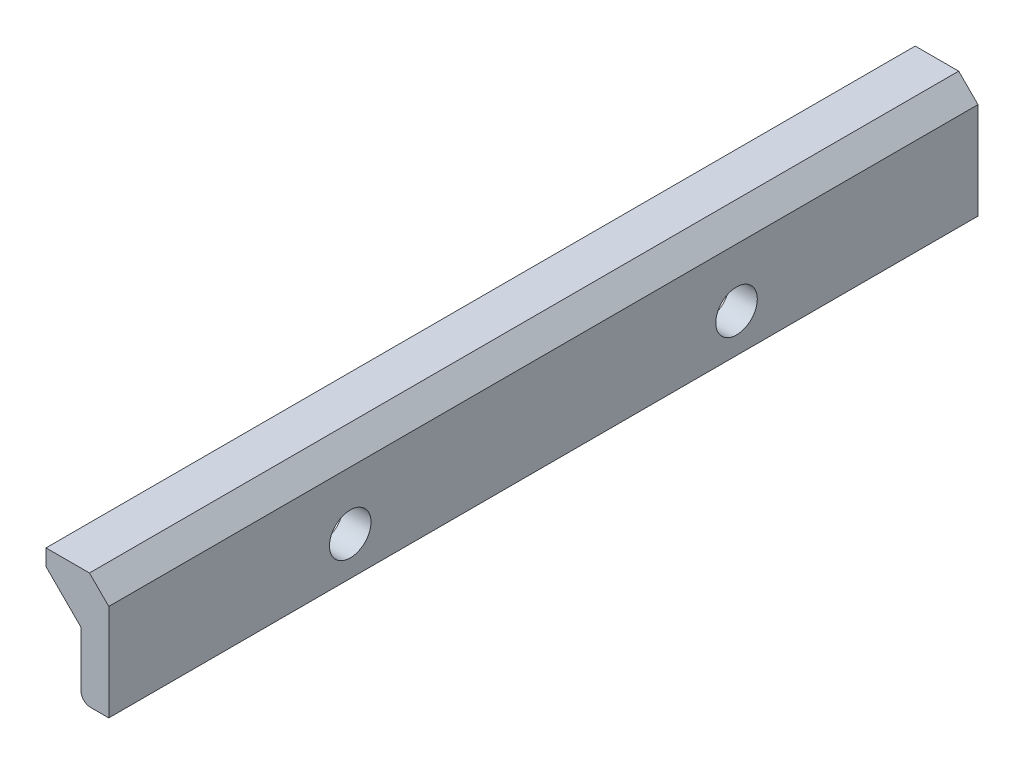
ISO-10303-21;
HEADER;
FILE_DESCRIPTION(('STEP AP214'),'2;1');
FILE_NAME('part.step','',(''),(''),'','','');
FILE_SCHEMA(('AUTOMOTIVE_DESIGN { 1 0 10303 214 1 1 1 1 }'));
ENDSEC;
DATA;
#1=APPLICATION_CONTEXT('core data for automotive mechanical design processes');
#2=APPLICATION_PROTOCOL_DEFINITION('international standard','automotive_design',2000,#1);
#3=PRODUCT_CONTEXT('',#1,'mechanical');
#4=PRODUCT('Part','Part','',(#3));
#5=PRODUCT_RELATED_PRODUCT_CATEGORY('part','',(#4));
#6=PRODUCT_DEFINITION_FORMATION('','',#4);
#7=PRODUCT_DEFINITION_CONTEXT('part definition',#1,'design');
#8=PRODUCT_DEFINITION('design','',#6,#7);
#9=PRODUCT_DEFINITION_SHAPE('','',#8);
#10=(LENGTH_UNIT() NAMED_UNIT(*) SI_UNIT(.MILLI.,.METRE.));
#11=(NAMED_UNIT(*) PLANE_ANGLE_UNIT() SI_UNIT($,.RADIAN.));
#12=(NAMED_UNIT(*) SI_UNIT($,.STERADIAN.) SOLID_ANGLE_UNIT());
#13=UNCERTAINTY_MEASURE_WITH_UNIT(LENGTH_MEASURE(1.E-05),#10,'distance_accuracy_value','');
#14=(GEOMETRIC_REPRESENTATION_CONTEXT(3) GLOBAL_UNCERTAINTY_ASSIGNED_CONTEXT((#13)) GLOBAL_UNIT_ASSIGNED_CONTEXT((#10,
#11,#12)) REPRESENTATION_CONTEXT('',''));
#15=CARTESIAN_POINT('',(0.,0.,0.));
#16=DIRECTION('',(0.,0.,1.));
#17=DIRECTION('',(1.,0.,0.));
#18=AXIS2_PLACEMENT_3D('',#15,#16,#17);
#19=CARTESIAN_POINT('',(3.61715728752537,-12.,90.));
#20=DIRECTION('',(0.,1.,0.));
#21=DIRECTION('',(0.,0.,1.));
#22=AXIS2_PLACEMENT_3D('',#19,#20,#21);
#23=PLANE('',#22);
#24=DIRECTION('',(1.,0.,0.));
#25=VECTOR('',#24,1.);
#26=CARTESIAN_POINT('',(3.61715728752537,-12.,90.));
#27=LINE('',#26,#25);
#28=CARTESIAN_POINT('',(4.61715728752537,-12.,90.));
#29=VERTEX_POINT('',#28);
#30=CARTESIAN_POINT('',(6.5,-12.,90.));
#31=VERTEX_POINT('',#30);
#32=EDGE_CURVE('E109',#29,#31,#27,.T.);
#33=ORIENTED_EDGE('',*,*,#32,.F.);
#34=DIRECTION('',(0.,0.,-1.));
#35=VECTOR('',#34,1.);
#36=CARTESIAN_POINT('',(4.61715728752537,-12.,90.));
#37=LINE('',#36,#35);
#38=CARTESIAN_POINT('',(4.61715728752537,-12.,0.));
#39=VERTEX_POINT('',#38);
#40=EDGE_CURVE('E132',#29,#39,#37,.T.);
#41=ORIENTED_EDGE('',*,*,#40,.T.);
#42=DIRECTION('',(1.,0.,0.));
#43=VECTOR('',#42,1.);
#44=CARTESIAN_POINT('',(3.61715728752537,-12.,0.));
#45=LINE('',#44,#43);
#46=CARTESIAN_POINT('',(6.5,-12.,0.));
#47=VERTEX_POINT('',#46);
#48=EDGE_CURVE('E130',#39,#47,#45,.T.);
#49=ORIENTED_EDGE('',*,*,#48,.T.);
#50=DIRECTION('',(0.,0.,-1.));
#51=VECTOR('',#50,1.);
#52=CARTESIAN_POINT('',(6.5,-12.,90.));
#53=LINE('',#52,#51);
#54=EDGE_CURVE('E124',#31,#47,#53,.T.);
#55=ORIENTED_EDGE('',*,*,#54,.F.);
#56=EDGE_LOOP('',(#33,#41,#49,#55));
#57=FACE_BOUND('',#56,.T.);
#58=ADVANCED_FACE('F45',(#57),#23,.F.);
#59=CARTESIAN_POINT('',(6.5,-12.,90.));
#60=DIRECTION('',(-1.,0.,0.));
#61=DIRECTION('',(0.,0.,1.));
#62=AXIS2_PLACEMENT_3D('',#59,#60,#61);
#63=PLANE('',#62);
#64=CARTESIAN_POINT('',(6.5,-8.,65.));
#65=DIRECTION('',(1.,0.,0.));
#66=DIRECTION('',(0.,0.,-1.));
#67=AXIS2_PLACEMENT_3D('',#64,#65,#66);
#68=CIRCLE('',#67,2.15);
#69=CARTESIAN_POINT('',(6.5,-8.,62.85));
#70=VERTEX_POINT('',#69);
#71=EDGE_CURVE('E175',#70,#70,#68,.T.);
#72=ORIENTED_EDGE('',*,*,#71,.F.);
#73=EDGE_LOOP('',(#72));
#74=FACE_BOUND('',#73,.T.);
#75=CARTESIAN_POINT('',(6.5,-8.,25.));
#76=DIRECTION('',(1.,0.,0.));
#77=DIRECTION('',(0.,0.,-1.));
#78=AXIS2_PLACEMENT_3D('',#75,#76,#77);
#79=CIRCLE('',#78,2.15);
#80=CARTESIAN_POINT('',(6.5,-8.,22.85));
#81=VERTEX_POINT('',#80);
#82=EDGE_CURVE('E172',#81,#81,#79,.T.);
#83=ORIENTED_EDGE('',*,*,#82,.F.);
#84=EDGE_LOOP('',(#83));
#85=FACE_BOUND('',#84,.T.);
#86=DIRECTION('',(0.,1.,0.));
#87=VECTOR('',#86,1.);
#88=CARTESIAN_POINT('',(6.5,-12.,0.));
#89=LINE('',#88,#87);
#90=CARTESIAN_POINT('',(6.5,-2.,0.));
#91=VERTEX_POINT('',#90);
#92=EDGE_CURVE('E160',#47,#91,#89,.T.);
#93=ORIENTED_EDGE('',*,*,#92,.T.);
#94=DIRECTION('',(0.,0.,-1.));
#95=VECTOR('',#94,1.);
#96=CARTESIAN_POINT('',(6.5,-2.,90.));
#97=LINE('',#96,#95);
#98=CARTESIAN_POINT('',(6.5,-2.,90.));
#99=VERTEX_POINT('',#98);
#100=EDGE_CURVE('E126',#99,#91,#97,.T.);
#101=ORIENTED_EDGE('',*,*,#100,.F.);
#102=DIRECTION('',(0.,1.,0.));
#103=VECTOR('',#102,1.);
#104=CARTESIAN_POINT('',(6.5,-12.,90.));
#105=LINE('',#104,#103);
#106=EDGE_CURVE('E112',#31,#99,#105,.T.);
#107=ORIENTED_EDGE('',*,*,#106,.F.);
#108=ORIENTED_EDGE('',*,*,#54,.T.);
#109=EDGE_LOOP('',(#93,#101,#107,#108));
#110=FACE_BOUND('',#109,.T.);
#111=ADVANCED_FACE('F123',(#74,#85,#110),#63,.F.);
#112=CARTESIAN_POINT('',(6.5,-2.,90.));
#113=DIRECTION('',(-0.707106781186547,-0.707106781186548,0.));
#114=DIRECTION('',(0.707106781186548,-0.707106781186547,0.));
#115=AXIS2_PLACEMENT_3D('',#112,#113,#114);
#116=PLANE('',#115);
#117=DIRECTION('',(-0.707106781186548,0.707106781186547,0.));
#118=VECTOR('',#117,1.);
#119=CARTESIAN_POINT('',(6.5,-2.,0.));
#120=LINE('',#119,#118);
#121=CARTESIAN_POINT('',(4.5,0.,0.));
#122=VERTEX_POINT('',#121);
#123=EDGE_CURVE('E158',#91,#122,#120,.T.);
#124=ORIENTED_EDGE('',*,*,#123,.T.);
#125=DIRECTION('',(0.,0.,-1.));
#126=VECTOR('',#125,1.);
#127=CARTESIAN_POINT('',(4.5,0.,90.));
#128=LINE('',#127,#126);
#129=CARTESIAN_POINT('',(4.5,0.,90.));
#130=VERTEX_POINT('',#129);
#131=EDGE_CURVE('E135',#130,#122,#128,.T.);
#132=ORIENTED_EDGE('',*,*,#131,.F.);
#133=DIRECTION('',(-0.707106781186548,0.707106781186547,0.));
#134=VECTOR('',#133,1.);
#135=CARTESIAN_POINT('',(6.5,-2.,90.));
#136=LINE('',#135,#134);
#137=EDGE_CURVE('E128',#99,#130,#136,.T.);
#138=ORIENTED_EDGE('',*,*,#137,.F.);
#139=ORIENTED_EDGE('',*,*,#100,.T.);
#140=EDGE_LOOP('',(#124,#132,#138,#139));
#141=FACE_BOUND('',#140,.T.);
#142=ADVANCED_FACE('F189',(#141),#116,.F.);
#143=CARTESIAN_POINT('',(4.5,0.,90.));
#144=DIRECTION('',(0.,-1.,0.));
#145=DIRECTION('',(0.,0.,-1.));
#146=AXIS2_PLACEMENT_3D('',#143,#144,#145);
#147=PLANE('',#146);
#148=DIRECTION('',(-1.,0.,0.));
#149=VECTOR('',#148,1.);
#150=CARTESIAN_POINT('',(4.5,0.,0.));
#151=LINE('',#150,#149);
#152=CARTESIAN_POINT('',(0.,0.,0.));
#153=VERTEX_POINT('',#152);
#154=EDGE_CURVE('E156',#122,#153,#151,.T.);
#155=ORIENTED_EDGE('',*,*,#154,.T.);
#156=DIRECTION('',(0.,0.,-1.));
#157=VECTOR('',#156,1.);
#158=CARTESIAN_POINT('',(0.,0.,90.));
#159=LINE('',#158,#157);
#160=CARTESIAN_POINT('',(0.,0.,90.));
#161=VERTEX_POINT('',#160);
#162=EDGE_CURVE('E141',#161,#153,#159,.T.);
#163=ORIENTED_EDGE('',*,*,#162,.F.);
#164=DIRECTION('',(-1.,0.,0.));
#165=VECTOR('',#164,1.);
#166=CARTESIAN_POINT('',(4.5,0.,90.));
#167=LINE('',#166,#165);
#168=EDGE_CURVE('E169',#130,#161,#167,.T.);
#169=ORIENTED_EDGE('',*,*,#168,.F.);
#170=ORIENTED_EDGE('',*,*,#131,.T.);
#171=EDGE_LOOP('',(#155,#163,#169,#170));
#172=FACE_BOUND('',#171,.T.);
#173=ADVANCED_FACE('F217',(#172),#147,.F.);
#174=CARTESIAN_POINT('',(0.,0.,90.));
#175=DIRECTION('',(1.,0.,0.));
#176=DIRECTION('',(0.,0.,-1.));
#177=AXIS2_PLACEMENT_3D('',#174,#175,#176);
#178=PLANE('',#177);
#179=DIRECTION('',(0.,-1.,0.));
#180=VECTOR('',#179,1.);
#181=CARTESIAN_POINT('',(0.,0.,0.));
#182=LINE('',#181,#180);
#183=CARTESIAN_POINT('',(0.,-1.68,0.));
#184=VERTEX_POINT('',#183);
#185=EDGE_CURVE('E154',#153,#184,#182,.T.);
#186=ORIENTED_EDGE('',*,*,#185,.T.);
#187=DIRECTION('',(0.,0.,-1.));
#188=VECTOR('',#187,1.);
#189=CARTESIAN_POINT('',(0.,-1.68,90.));
#190=LINE('',#189,#188);
#191=CARTESIAN_POINT('',(0.,-1.68,90.));
#192=VERTEX_POINT('',#191);
#193=EDGE_CURVE('E144',#192,#184,#190,.T.);
#194=ORIENTED_EDGE('',*,*,#193,.F.);
#195=DIRECTION('',(0.,-1.,0.));
#196=VECTOR('',#195,1.);
#197=CARTESIAN_POINT('',(0.,0.,90.));
#198=LINE('',#197,#196);
#199=EDGE_CURVE('E167',#161,#192,#198,.T.);
#200=ORIENTED_EDGE('',*,*,#199,.F.);
#201=ORIENTED_EDGE('',*,*,#162,.T.);
#202=EDGE_LOOP('',(#186,#194,#200,#201));
#203=FACE_BOUND('',#202,.T.);
#204=ADVANCED_FACE('F220',(#203),#178,.F.);
#205=CARTESIAN_POINT('',(3.61715728752537,-5.29715728752536,90.));
#206=DIRECTION('',(0.707106781186547,0.707106781186548,0.));
#207=DIRECTION('',(-0.707106781186548,0.707106781186547,0.));
#208=AXIS2_PLACEMENT_3D('',#205,#206,#207);
#209=PLANE('',#208);
#210=DIRECTION('',(0.707106781186548,-0.707106781186547,0.));
#211=VECTOR('',#210,1.);
#212=CARTESIAN_POINT('',(3.61715728752537,-5.29715728752536,0.));
#213=LINE('',#212,#211);
#214=CARTESIAN_POINT('',(3.61715728752537,-5.29715728752536,0.));
#215=VERTEX_POINT('',#214);
#216=EDGE_CURVE('E152',#184,#215,#213,.T.);
#217=ORIENTED_EDGE('',*,*,#216,.T.);
#218=DIRECTION('',(0.,0.,-1.));
#219=VECTOR('',#218,1.);
#220=CARTESIAN_POINT('',(3.61715728752537,-5.29715728752536,90.));
#221=LINE('',#220,#219);
#222=CARTESIAN_POINT('',(3.61715728752537,-5.29715728752536,90.));
#223=VERTEX_POINT('',#222);
#224=EDGE_CURVE('E147',#223,#215,#221,.T.);
#225=ORIENTED_EDGE('',*,*,#224,.F.);
#226=DIRECTION('',(0.707106781186548,-0.707106781186547,0.));
#227=VECTOR('',#226,1.);
#228=CARTESIAN_POINT('',(3.61715728752537,-5.29715728752536,90.));
#229=LINE('',#228,#227);
#230=EDGE_CURVE('E165',#192,#223,#229,.T.);
#231=ORIENTED_EDGE('',*,*,#230,.F.);
#232=ORIENTED_EDGE('',*,*,#193,.T.);
#233=EDGE_LOOP('',(#217,#225,#231,#232));
#234=FACE_BOUND('',#233,.T.);
#235=ADVANCED_FACE('F202',(#234),#209,.F.);
#236=CARTESIAN_POINT('',(3.61715728752537,-12.,90.));
#237=DIRECTION('',(1.,0.,0.));
#238=DIRECTION('',(0.,1.,0.));
#239=AXIS2_PLACEMENT_3D('',#236,#237,#238);
#240=PLANE('',#239);
#241=CARTESIAN_POINT('',(3.61715728752537,-8.,65.));
#242=DIRECTION('',(1.,0.,0.));
#243=DIRECTION('',(0.,1.,0.));
#244=AXIS2_PLACEMENT_3D('',#241,#242,#243);
#245=CIRCLE('',#244,2.15);
#246=CARTESIAN_POINT('',(3.61715728752537,-8.,62.85));
#247=VERTEX_POINT('',#246);
#248=EDGE_CURVE('E163',#247,#247,#245,.F.);
#249=ORIENTED_EDGE('',*,*,#248,.F.);
#250=EDGE_LOOP('',(#249));
#251=FACE_BOUND('',#250,.T.);
#252=CARTESIAN_POINT('',(3.61715728752537,-8.,25.));
#253=DIRECTION('',(1.,0.,0.));
#254=DIRECTION('',(0.,1.,0.));
#255=AXIS2_PLACEMENT_3D('',#252,#253,#254);
#256=CIRCLE('',#255,2.15);
#257=CARTESIAN_POINT('',(3.61715728752537,-8.,22.85));
#258=VERTEX_POINT('',#257);
#259=EDGE_CURVE('E176',#258,#258,#256,.F.);
#260=ORIENTED_EDGE('',*,*,#259,.F.);
#261=EDGE_LOOP('',(#260));
#262=FACE_BOUND('',#261,.T.);
#263=DIRECTION('',(0.,-1.,0.));
#264=VECTOR('',#263,1.);
#265=CARTESIAN_POINT('',(3.61715728752537,-12.,0.));
#266=LINE('',#265,#264);
#267=CARTESIAN_POINT('',(3.61715728752537,-11.,0.));
#268=VERTEX_POINT('',#267);
#269=EDGE_CURVE('E119',#215,#268,#266,.T.);
#270=ORIENTED_EDGE('',*,*,#269,.T.);
#271=DIRECTION('',(0.,0.,-1.));
#272=VECTOR('',#271,1.);
#273=CARTESIAN_POINT('',(3.61715728752537,-11.,90.));
#274=LINE('',#273,#272);
#275=CARTESIAN_POINT('',(3.61715728752537,-11.,90.));
#276=VERTEX_POINT('',#275);
#277=EDGE_CURVE('E53',#268,#276,#274,.F.);
#278=ORIENTED_EDGE('',*,*,#277,.T.);
#279=DIRECTION('',(0.,-1.,0.));
#280=VECTOR('',#279,1.);
#281=CARTESIAN_POINT('',(3.61715728752537,-12.,90.));
#282=LINE('',#281,#280);
#283=EDGE_CURVE('E150',#223,#276,#282,.T.);
#284=ORIENTED_EDGE('',*,*,#283,.F.);
#285=ORIENTED_EDGE('',*,*,#224,.T.);
#286=EDGE_LOOP('',(#270,#278,#284,#285));
#287=FACE_BOUND('',#286,.T.);
#288=ADVANCED_FACE('F200',(#251,#262,#287),#240,.F.);
#289=CARTESIAN_POINT('',(0.,0.,90.));
#290=DIRECTION('',(0.,0.,1.));
#291=DIRECTION('',(1.,0.,0.));
#292=AXIS2_PLACEMENT_3D('',#289,#290,#291);
#293=PLANE('',#292);
#294=ORIENTED_EDGE('',*,*,#283,.T.);
#295=CARTESIAN_POINT('',(4.61715728752537,-11.,90.));
#296=DIRECTION('',(0.,0.,1.));
#297=DIRECTION('',(1.,0.,0.));
#298=AXIS2_PLACEMENT_3D('',#295,#296,#297);
#299=CIRCLE('',#298,1.);
#300=EDGE_CURVE('E11',#276,#29,#299,.T.);
#301=ORIENTED_EDGE('',*,*,#300,.T.);
#302=ORIENTED_EDGE('',*,*,#32,.T.);
#303=ORIENTED_EDGE('',*,*,#106,.T.);
#304=ORIENTED_EDGE('',*,*,#137,.T.);
#305=ORIENTED_EDGE('',*,*,#168,.T.);
#306=ORIENTED_EDGE('',*,*,#199,.T.);
#307=ORIENTED_EDGE('',*,*,#230,.T.);
#308=EDGE_LOOP('',(#294,#301,#302,#303,#304,#305,#306,#307));
#309=FACE_BOUND('',#308,.T.);
#310=ADVANCED_FACE('F111',(#309),#293,.T.);
#311=CARTESIAN_POINT('',(0.,0.,0.));
#312=DIRECTION('',(0.,0.,1.));
#313=DIRECTION('',(1.,0.,0.));
#314=AXIS2_PLACEMENT_3D('',#311,#312,#313);
#315=PLANE('',#314);
#316=ORIENTED_EDGE('',*,*,#48,.F.);
#317=CARTESIAN_POINT('',(4.61715728752537,-11.,0.));
#318=DIRECTION('',(0.,0.,1.));
#319=DIRECTION('',(1.,0.,0.));
#320=AXIS2_PLACEMENT_3D('',#317,#318,#319);
#321=CIRCLE('',#320,1.);
#322=EDGE_CURVE('E67',#39,#268,#321,.F.);
#323=ORIENTED_EDGE('',*,*,#322,.T.);
#324=ORIENTED_EDGE('',*,*,#269,.F.);
#325=ORIENTED_EDGE('',*,*,#216,.F.);
#326=ORIENTED_EDGE('',*,*,#185,.F.);
#327=ORIENTED_EDGE('',*,*,#154,.F.);
#328=ORIENTED_EDGE('',*,*,#123,.F.);
#329=ORIENTED_EDGE('',*,*,#92,.F.);
#330=EDGE_LOOP('',(#316,#323,#324,#325,#326,#327,#328,#329));
#331=FACE_BOUND('',#330,.T.);
#332=ADVANCED_FACE('F196',(#331),#315,.F.);
#333=CARTESIAN_POINT('',(-0.00100000000000013,-8.,25.));
#334=DIRECTION('',(1.,0.,0.));
#335=DIRECTION('',(0.,0.,-1.));
#336=AXIS2_PLACEMENT_3D('',#333,#334,#335);
#337=CYLINDRICAL_SURFACE('',#336,2.15);
#338=CARTESIAN_POINT('',(6.5,-8.,22.85));
#339=CARTESIAN_POINT('',(6.46997038841172,-8.,22.85));
#340=CARTESIAN_POINT('',(6.43994077682344,-8.,22.85));
#341=CARTESIAN_POINT('',(6.37988155364689,-8.,22.85));
#342=CARTESIAN_POINT('',(6.34985194205861,-8.,22.85));
#343=CARTESIAN_POINT('',(6.28979271888206,-8.,22.85));
#344=CARTESIAN_POINT('',(6.25976310729378,-8.,22.85));
#345=CARTESIAN_POINT('',(6.19970388411723,-8.,22.85));
#346=CARTESIAN_POINT('',(6.16967427252895,-8.,22.85));
#347=CARTESIAN_POINT('',(6.10961504935239,-8.,22.85));
#348=CARTESIAN_POINT('',(6.07958543776412,-8.,22.85));
#349=CARTESIAN_POINT('',(6.01952621458756,-8.,22.85));
#350=CARTESIAN_POINT('',(5.98949660299928,-8.,22.85));
#351=CARTESIAN_POINT('',(5.92943737982273,-8.,22.85));
#352=CARTESIAN_POINT('',(5.89940776823445,-8.,22.85));
#353=CARTESIAN_POINT('',(5.8393485450579,-8.,22.85));
#354=CARTESIAN_POINT('',(5.80931893346962,-8.,22.85));
#355=CARTESIAN_POINT('',(5.74925971029306,-8.,22.85));
#356=CARTESIAN_POINT('',(5.71923009870479,-8.,22.85));
#357=CARTESIAN_POINT('',(5.65917087552823,-8.,22.85));
#358=CARTESIAN_POINT('',(5.62914126393995,-8.,22.85));
#359=CARTESIAN_POINT('',(5.5690820407634,-8.,22.85));
#360=CARTESIAN_POINT('',(5.53905242917512,-8.,22.85));
#361=CARTESIAN_POINT('',(5.47899320599857,-8.,22.85));
#362=CARTESIAN_POINT('',(5.44896359441029,-8.,22.85));
#363=CARTESIAN_POINT('',(5.38890437123373,-8.,22.85));
#364=CARTESIAN_POINT('',(5.35887475964546,-8.,22.85));
#365=CARTESIAN_POINT('',(5.2988155364689,-8.,22.85));
#366=CARTESIAN_POINT('',(5.26878592488062,-8.,22.85));
#367=CARTESIAN_POINT('',(5.20872670170407,-8.,22.85));
#368=CARTESIAN_POINT('',(5.17869709011579,-8.,22.85));
#369=CARTESIAN_POINT('',(5.11863786693924,-8.,22.85));
#370=CARTESIAN_POINT('',(5.08860825535096,-8.,22.85));
#371=CARTESIAN_POINT('',(5.02854903217441,-8.,22.85));
#372=CARTESIAN_POINT('',(4.99851942058613,-8.,22.85));
#373=CARTESIAN_POINT('',(4.93846019740957,-8.,22.85));
#374=CARTESIAN_POINT('',(4.9084305858213,-8.,22.85));
#375=CARTESIAN_POINT('',(4.84837136264474,-8.,22.85));
#376=CARTESIAN_POINT('',(4.81834175105646,-8.,22.85));
#377=CARTESIAN_POINT('',(4.75828252787991,-8.,22.85));
#378=CARTESIAN_POINT('',(4.72825291629163,-8.,22.85));
#379=CARTESIAN_POINT('',(4.66819369311508,-8.,22.85));
#380=CARTESIAN_POINT('',(4.6381640815268,-8.,22.85));
#381=CARTESIAN_POINT('',(4.57810485835024,-8.,22.85));
#382=CARTESIAN_POINT('',(4.54807524676197,-8.,22.85));
#383=CARTESIAN_POINT('',(4.48801602358541,-8.,22.85));
#384=CARTESIAN_POINT('',(4.45798641199714,-8.,22.85));
#385=CARTESIAN_POINT('',(4.39792718882058,-8.,22.85));
#386=CARTESIAN_POINT('',(4.3678975772323,-8.,22.85));
#387=CARTESIAN_POINT('',(4.30783835405575,-8.,22.85));
#388=CARTESIAN_POINT('',(4.27780874246747,-8.,22.85));
#389=CARTESIAN_POINT('',(4.21774951929092,-8.,22.85));
#390=CARTESIAN_POINT('',(4.18771990770264,-8.,22.85));
#391=CARTESIAN_POINT('',(4.12766068452608,-8.,22.85));
#392=CARTESIAN_POINT('',(4.09763107293781,-8.,22.85));
#393=CARTESIAN_POINT('',(4.03757184976125,-8.,22.85));
#394=CARTESIAN_POINT('',(4.00754223817297,-8.,22.85));
#395=CARTESIAN_POINT('',(3.94748301499642,-8.,22.85));
#396=CARTESIAN_POINT('',(3.91745340340814,-8.,22.85));
#397=CARTESIAN_POINT('',(3.85739418023159,-8.,22.85));
#398=CARTESIAN_POINT('',(3.82736456864331,-8.,22.85));
#399=CARTESIAN_POINT('',(3.76730534546676,-8.,22.85));
#400=CARTESIAN_POINT('',(3.73727573387848,-8.,22.85));
#401=CARTESIAN_POINT('',(3.67721651070192,-8.,22.85));
#402=CARTESIAN_POINT('',(3.64718689911365,-8.,22.85));
#403=CARTESIAN_POINT('',(3.61715728752537,-8.,22.85));
#404=B_SPLINE_CURVE_WITH_KNOTS('',3,(#338,#339,#340,#341,#342,#343,#344,#345,#346,#347,#348,
#349,#350,#351,#352,#353,#354,#355,#356,#357,#358,#359,#360,#361,#362,#363,#364,#365,#366,#367,
#368,#369,#370,#371,#372,#373,#374,#375,#376,#377,#378,#379,#380,#381,#382,#383,#384,#385,#386,
#387,#388,#389,#390,#391,#392,#393,#394,#395,#396,#397,#398,#399,#400,#401,#402,#403),
.UNSPECIFIED.,.F.,.F.,(4,2,2,2,2,2,2,2,2,2,2,2,2,2,2,2,2,2,2,2,2,2,2,2,2,2,2,2,2,2,2,2,4),(0.,
0.0900888347648322,0.180177669529664,0.270266504294497,0.360355339059329,0.450444173824161,
0.540533008588993,0.630621843353826,0.720710678118658,0.81079951288349,0.900888347648322,
0.990977182413155,1.08106601717799,1.17115485194282,1.26124368670765,1.35133252147248,
1.44142135623732,1.53151019100215,1.62159902576698,1.71168786053181,1.80177669529664,
1.89186553006148,1.98195436482631,2.07204319959114,2.16213203435597,2.25222086912081,
2.34230970388564,2.43239853865047,2.5224873734153,2.61257620818013,2.70266504294497,
2.7927538777098,2.88284271247463),.UNSPECIFIED.);
#405=EDGE_CURVE('BSEAM193',#81,#258,#404,.T.);
#406=ORIENTED_EDGE('',*,*,#82,.T.);
#407=ORIENTED_EDGE('',*,*,#259,.T.);
#408=ORIENTED_EDGE('',*,*,#405,.T.);
#409=ORIENTED_EDGE('',*,*,#405,.F.);
#410=EDGE_LOOP('',(#406,#408,#407,#409));
#411=FACE_BOUND('',#410,.T.);
#412=ADVANCED_FACE('F193',(#411),#337,.F.);
#413=CARTESIAN_POINT('',(-0.00100000000000013,-8.,65.));
#414=DIRECTION('',(1.,0.,0.));
#415=DIRECTION('',(0.,0.,-1.));
#416=AXIS2_PLACEMENT_3D('',#413,#414,#415);
#417=CYLINDRICAL_SURFACE('',#416,2.15);
#418=CARTESIAN_POINT('',(6.5,-8.,62.85));
#419=CARTESIAN_POINT('',(6.46997038841172,-8.,62.85));
#420=CARTESIAN_POINT('',(6.43994077682344,-8.,62.85));
#421=CARTESIAN_POINT('',(6.37988155364689,-8.,62.85));
#422=CARTESIAN_POINT('',(6.34985194205861,-8.,62.85));
#423=CARTESIAN_POINT('',(6.28979271888206,-8.,62.85));
#424=CARTESIAN_POINT('',(6.25976310729378,-8.,62.85));
#425=CARTESIAN_POINT('',(6.19970388411723,-8.,62.85));
#426=CARTESIAN_POINT('',(6.16967427252895,-8.,62.85));
#427=CARTESIAN_POINT('',(6.10961504935239,-8.,62.85));
#428=CARTESIAN_POINT('',(6.07958543776412,-8.,62.85));
#429=CARTESIAN_POINT('',(6.01952621458756,-8.,62.85));
#430=CARTESIAN_POINT('',(5.98949660299928,-8.,62.85));
#431=CARTESIAN_POINT('',(5.92943737982273,-8.,62.85));
#432=CARTESIAN_POINT('',(5.89940776823445,-8.,62.85));
#433=CARTESIAN_POINT('',(5.8393485450579,-8.,62.85));
#434=CARTESIAN_POINT('',(5.80931893346962,-8.,62.85));
#435=CARTESIAN_POINT('',(5.74925971029306,-8.,62.85));
#436=CARTESIAN_POINT('',(5.71923009870479,-8.,62.85));
#437=CARTESIAN_POINT('',(5.65917087552823,-8.,62.85));
#438=CARTESIAN_POINT('',(5.62914126393995,-8.,62.85));
#439=CARTESIAN_POINT('',(5.5690820407634,-8.,62.85));
#440=CARTESIAN_POINT('',(5.53905242917512,-8.,62.85));
#441=CARTESIAN_POINT('',(5.47899320599857,-8.,62.85));
#442=CARTESIAN_POINT('',(5.44896359441029,-8.,62.85));
#443=CARTESIAN_POINT('',(5.38890437123373,-8.,62.85));
#444=CARTESIAN_POINT('',(5.35887475964546,-8.,62.85));
#445=CARTESIAN_POINT('',(5.2988155364689,-8.,62.85));
#446=CARTESIAN_POINT('',(5.26878592488062,-8.,62.85));
#447=CARTESIAN_POINT('',(5.20872670170407,-8.,62.85));
#448=CARTESIAN_POINT('',(5.17869709011579,-8.,62.85));
#449=CARTESIAN_POINT('',(5.11863786693924,-8.,62.85));
#450=CARTESIAN_POINT('',(5.08860825535096,-8.,62.85));
#451=CARTESIAN_POINT('',(5.02854903217441,-8.,62.85));
#452=CARTESIAN_POINT('',(4.99851942058613,-8.,62.85));
#453=CARTESIAN_POINT('',(4.93846019740957,-8.,62.85));
#454=CARTESIAN_POINT('',(4.9084305858213,-8.,62.85));
#455=CARTESIAN_POINT('',(4.84837136264474,-8.,62.85));
#456=CARTESIAN_POINT('',(4.81834175105646,-8.,62.85));
#457=CARTESIAN_POINT('',(4.75828252787991,-8.,62.85));
#458=CARTESIAN_POINT('',(4.72825291629163,-8.,62.85));
#459=CARTESIAN_POINT('',(4.66819369311508,-8.,62.85));
#460=CARTESIAN_POINT('',(4.6381640815268,-8.,62.85));
#461=CARTESIAN_POINT('',(4.57810485835024,-8.,62.85));
#462=CARTESIAN_POINT('',(4.54807524676197,-8.,62.85));
#463=CARTESIAN_POINT('',(4.48801602358541,-8.,62.85));
#464=CARTESIAN_POINT('',(4.45798641199714,-8.,62.85));
#465=CARTESIAN_POINT('',(4.39792718882058,-8.,62.85));
#466=CARTESIAN_POINT('',(4.3678975772323,-8.,62.85));
#467=CARTESIAN_POINT('',(4.30783835405575,-8.,62.85));
#468=CARTESIAN_POINT('',(4.27780874246747,-8.,62.85));
#469=CARTESIAN_POINT('',(4.21774951929092,-8.,62.85));
#470=CARTESIAN_POINT('',(4.18771990770264,-8.,62.85));
#471=CARTESIAN_POINT('',(4.12766068452608,-8.,62.85));
#472=CARTESIAN_POINT('',(4.09763107293781,-8.,62.85));
#473=CARTESIAN_POINT('',(4.03757184976125,-8.,62.85));
#474=CARTESIAN_POINT('',(4.00754223817297,-8.,62.85));
#475=CARTESIAN_POINT('',(3.94748301499642,-8.,62.85));
#476=CARTESIAN_POINT('',(3.91745340340814,-8.,62.85));
#477=CARTESIAN_POINT('',(3.85739418023159,-8.,62.85));
#478=CARTESIAN_POINT('',(3.82736456864331,-8.,62.85));
#479=CARTESIAN_POINT('',(3.76730534546676,-8.,62.85));
#480=CARTESIAN_POINT('',(3.73727573387848,-8.,62.85));
#481=CARTESIAN_POINT('',(3.67721651070192,-8.,62.85));
#482=CARTESIAN_POINT('',(3.64718689911365,-8.,62.85));
#483=CARTESIAN_POINT('',(3.61715728752537,-8.,62.85));
#484=B_SPLINE_CURVE_WITH_KNOTS('',3,(#418,#419,#420,#421,#422,#423,#424,#425,#426,#427,#428,
#429,#430,#431,#432,#433,#434,#435,#436,#437,#438,#439,#440,#441,#442,#443,#444,#445,#446,#447,
#448,#449,#450,#451,#452,#453,#454,#455,#456,#457,#458,#459,#460,#461,#462,#463,#464,#465,#466,
#467,#468,#469,#470,#471,#472,#473,#474,#475,#476,#477,#478,#479,#480,#481,#482,#483),
.UNSPECIFIED.,.F.,.F.,(4,2,2,2,2,2,2,2,2,2,2,2,2,2,2,2,2,2,2,2,2,2,2,2,2,2,2,2,2,2,2,2,4),(0.,
0.0900888347648322,0.180177669529664,0.270266504294497,0.360355339059329,0.450444173824161,
0.540533008588993,0.630621843353826,0.720710678118658,0.81079951288349,0.900888347648322,
0.990977182413155,1.08106601717799,1.17115485194282,1.26124368670765,1.35133252147248,
1.44142135623732,1.53151019100215,1.62159902576698,1.71168786053181,1.80177669529664,
1.89186553006148,1.98195436482631,2.07204319959114,2.16213203435597,2.25222086912081,
2.34230970388564,2.43239853865047,2.5224873734153,2.61257620818013,2.70266504294497,
2.7927538777098,2.88284271247463),.UNSPECIFIED.);
#485=EDGE_CURVE('BSEAM184',#70,#247,#484,.T.);
#486=ORIENTED_EDGE('',*,*,#71,.T.);
#487=ORIENTED_EDGE('',*,*,#248,.T.);
#488=ORIENTED_EDGE('',*,*,#485,.T.);
#489=ORIENTED_EDGE('',*,*,#485,.F.);
#490=EDGE_LOOP('',(#486,#488,#487,#489));
#491=FACE_BOUND('',#490,.T.);
#492=ADVANCED_FACE('F184',(#491),#417,.F.);
#493=CARTESIAN_POINT('',(4.61715728752537,-11.,90.));
#494=DIRECTION('',(0.,0.,-1.));
#495=DIRECTION('',(-1.,0.,0.));
#496=AXIS2_PLACEMENT_3D('',#493,#494,#495);
#497=CYLINDRICAL_SURFACE('',#496,1.);
#498=ORIENTED_EDGE('',*,*,#300,.F.);
#499=ORIENTED_EDGE('',*,*,#277,.F.);
#500=ORIENTED_EDGE('',*,*,#322,.F.);
#501=ORIENTED_EDGE('',*,*,#40,.F.);
#502=EDGE_LOOP('',(#498,#499,#500,#501));
#503=FACE_BOUND('',#502,.T.);
#504=ADVANCED_FACE('F47',(#503),#497,.T.);
#505=CLOSED_SHELL('',(#58,#111,#142,#173,#204,#235,#288,#310,#332,#412,#492,#504));
#506=MANIFOLD_SOLID_BREP('B2',#505);
#507=ADVANCED_BREP_SHAPE_REPRESENTATION('',(#18,#506),#14);
#508=SHAPE_DEFINITION_REPRESENTATION(#9,#507);
ENDSEC;
END-ISO-10303-21;
